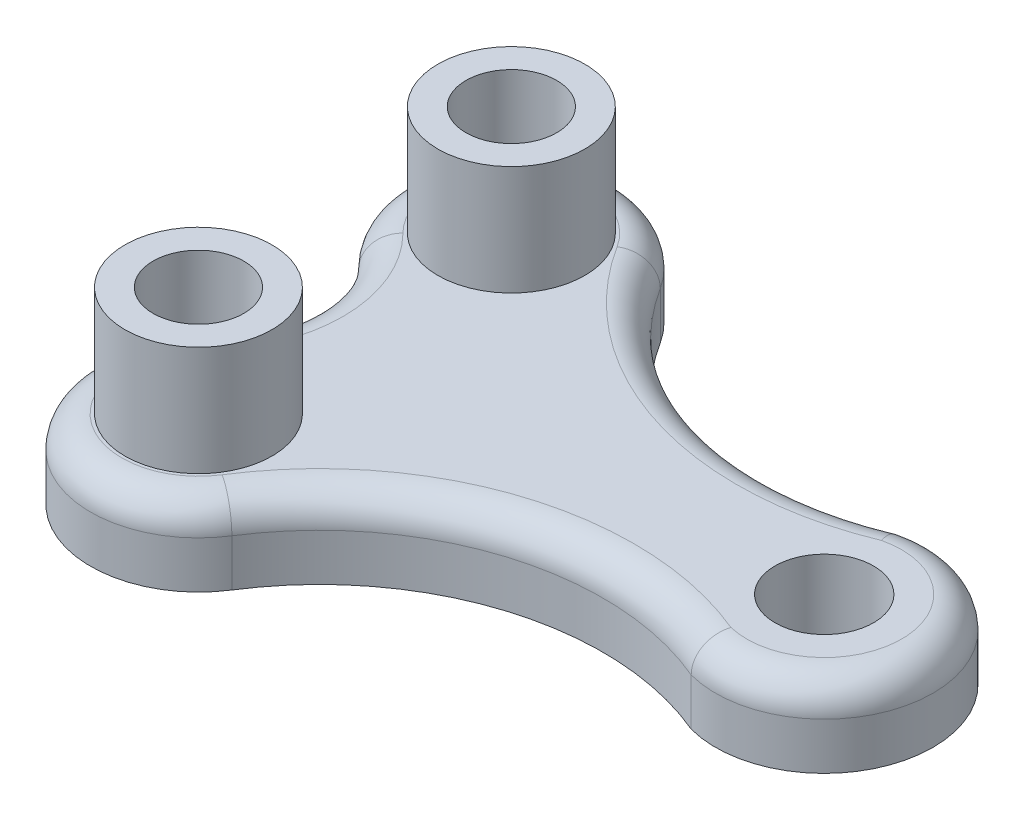
ISO-10303-21;
HEADER;
FILE_DESCRIPTION(('STEP AP214'),'2;1');
FILE_NAME('part.step','',(''),(''),'','','');
FILE_SCHEMA(('AUTOMOTIVE_DESIGN { 1 0 10303 214 1 1 1 1 }'));
ENDSEC;
DATA;
#1=APPLICATION_CONTEXT('core data for automotive mechanical design processes');
#2=APPLICATION_PROTOCOL_DEFINITION('international standard','automotive_design',2000,#1);
#3=PRODUCT_CONTEXT('',#1,'mechanical');
#4=PRODUCT('Part','Part','',(#3));
#5=PRODUCT_RELATED_PRODUCT_CATEGORY('part','',(#4));
#6=PRODUCT_DEFINITION_FORMATION('','',#4);
#7=PRODUCT_DEFINITION_CONTEXT('part definition',#1,'design');
#8=PRODUCT_DEFINITION('design','',#6,#7);
#9=PRODUCT_DEFINITION_SHAPE('','',#8);
#10=(LENGTH_UNIT() NAMED_UNIT(*) SI_UNIT(.MILLI.,.METRE.));
#11=(NAMED_UNIT(*) PLANE_ANGLE_UNIT() SI_UNIT($,.RADIAN.));
#12=(NAMED_UNIT(*) SI_UNIT($,.STERADIAN.) SOLID_ANGLE_UNIT());
#13=UNCERTAINTY_MEASURE_WITH_UNIT(LENGTH_MEASURE(1.E-05),#10,'distance_accuracy_value','');
#14=(GEOMETRIC_REPRESENTATION_CONTEXT(3) GLOBAL_UNCERTAINTY_ASSIGNED_CONTEXT((#13)) GLOBAL_UNIT_ASSIGNED_CONTEXT((#10,
#11,#12)) REPRESENTATION_CONTEXT('',''));
#15=CARTESIAN_POINT('',(0.,0.,0.));
#16=DIRECTION('',(0.,0.,1.));
#17=DIRECTION('',(1.,0.,0.));
#18=AXIS2_PLACEMENT_3D('',#15,#16,#17);
#19=CARTESIAN_POINT('',(0.,6.,-5.));
#20=DIRECTION('',(0.,1.,0.));
#21=DIRECTION('',(0.,0.,1.));
#22=AXIS2_PLACEMENT_3D('',#19,#20,#21);
#23=PLANE('',#22);
#24=CARTESIAN_POINT('',(0.,6.,-5.));
#25=DIRECTION('',(0.,1.,0.));
#26=DIRECTION('',(0.,0.,1.));
#27=AXIS2_PLACEMENT_3D('',#24,#25,#26);
#28=CIRCLE('',#27,1.45);
#29=CARTESIAN_POINT('',(0.,6.,-3.55));
#30=VERTEX_POINT('',#29);
#31=EDGE_CURVE('E168',#30,#30,#28,.T.);
#32=ORIENTED_EDGE('',*,*,#31,.F.);
#33=EDGE_LOOP('',(#32));
#34=FACE_BOUND('',#33,.T.);
#35=CARTESIAN_POINT('',(0.,6.,-5.));
#36=DIRECTION('',(0.,1.,0.));
#37=DIRECTION('',(0.,0.,1.));
#38=AXIS2_PLACEMENT_3D('',#35,#36,#37);
#39=CIRCLE('',#38,2.35);
#40=CARTESIAN_POINT('',(0.,6.,-2.65));
#41=VERTEX_POINT('',#40);
#42=EDGE_CURVE('E235',#41,#41,#39,.T.);
#43=ORIENTED_EDGE('',*,*,#42,.T.);
#44=EDGE_LOOP('',(#43));
#45=FACE_BOUND('',#44,.T.);
#46=ADVANCED_FACE('F39',(#34,#45),#23,.T.);
#47=CARTESIAN_POINT('',(0.,6.,5.));
#48=DIRECTION('',(0.,1.,0.));
#49=DIRECTION('',(0.,0.,1.));
#50=AXIS2_PLACEMENT_3D('',#47,#48,#49);
#51=PLANE('',#50);
#52=CARTESIAN_POINT('',(0.,6.,5.));
#53=DIRECTION('',(0.,1.,0.));
#54=DIRECTION('',(0.,0.,1.));
#55=AXIS2_PLACEMENT_3D('',#52,#53,#54);
#56=CIRCLE('',#55,1.45);
#57=CARTESIAN_POINT('',(0.,6.,6.45));
#58=VERTEX_POINT('',#57);
#59=EDGE_CURVE('E220',#58,#58,#56,.T.);
#60=ORIENTED_EDGE('',*,*,#59,.F.);
#61=EDGE_LOOP('',(#60));
#62=FACE_BOUND('',#61,.T.);
#63=CARTESIAN_POINT('',(0.,6.,5.));
#64=DIRECTION('',(0.,1.,0.));
#65=DIRECTION('',(0.,0.,1.));
#66=AXIS2_PLACEMENT_3D('',#63,#64,#65);
#67=CIRCLE('',#66,2.35000000000001);
#68=CARTESIAN_POINT('',(0.,6.,7.35000000000001));
#69=VERTEX_POINT('',#68);
#70=EDGE_CURVE('E238',#69,#69,#67,.T.);
#71=ORIENTED_EDGE('',*,*,#70,.T.);
#72=EDGE_LOOP('',(#71));
#73=FACE_BOUND('',#72,.T.);
#74=ADVANCED_FACE('F261',(#62,#73),#51,.T.);
#75=CARTESIAN_POINT('',(0.,2.5,-5.));
#76=DIRECTION('',(0.,-1.,0.));
#77=DIRECTION('',(0.,0.,-1.));
#78=AXIS2_PLACEMENT_3D('',#75,#76,#77);
#79=CYLINDRICAL_SURFACE('',#78,1.45);
#80=CARTESIAN_POINT('',(0.,0.,-5.));
#81=DIRECTION('',(0.,1.,0.));
#82=DIRECTION('',(0.,0.,1.));
#83=AXIS2_PLACEMENT_3D('',#80,#81,#82);
#84=CIRCLE('',#83,1.45);
#85=CARTESIAN_POINT('',(0.,0.,-3.55));
#86=VERTEX_POINT('',#85);
#87=EDGE_CURVE('E213',#86,#86,#84,.T.);
#88=ORIENTED_EDGE('',*,*,#87,.F.);
#89=EDGE_LOOP('',(#88));
#90=FACE_BOUND('',#89,.T.);
#91=ORIENTED_EDGE('',*,*,#31,.T.);
#92=EDGE_LOOP('',(#91));
#93=FACE_BOUND('',#92,.T.);
#94=ADVANCED_FACE('F268',(#90,#93),#79,.F.);
#95=CARTESIAN_POINT('',(0.,2.5,5.));
#96=DIRECTION('',(0.,-1.,0.));
#97=DIRECTION('',(0.,0.,-1.));
#98=AXIS2_PLACEMENT_3D('',#95,#96,#97);
#99=CYLINDRICAL_SURFACE('',#98,1.45);
#100=CARTESIAN_POINT('',(0.,0.,5.));
#101=DIRECTION('',(0.,1.,0.));
#102=DIRECTION('',(0.,0.,-1.));
#103=AXIS2_PLACEMENT_3D('',#100,#101,#102);
#104=CIRCLE('',#103,1.45);
#105=CARTESIAN_POINT('',(0.,0.,3.55));
#106=VERTEX_POINT('',#105);
#107=EDGE_CURVE('E216',#106,#106,#104,.T.);
#108=ORIENTED_EDGE('',*,*,#107,.F.);
#109=EDGE_LOOP('',(#108));
#110=FACE_BOUND('',#109,.T.);
#111=ORIENTED_EDGE('',*,*,#59,.T.);
#112=EDGE_LOOP('',(#111));
#113=FACE_BOUND('',#112,.T.);
#114=ADVANCED_FACE('F249',(#110,#113),#99,.F.);
#115=CARTESIAN_POINT('',(-2.5,2.5,-2.5));
#116=DIRECTION('',(0.,1.,0.));
#117=DIRECTION('',(0.,0.,1.));
#118=AXIS2_PLACEMENT_3D('',#115,#116,#117);
#119=PLANE('',#118);
#120=CARTESIAN_POINT('',(15.,2.5,0.));
#121=DIRECTION('',(0.,1.,0.));
#122=DIRECTION('',(0.,0.,1.));
#123=AXIS2_PLACEMENT_3D('',#120,#121,#122);
#124=CIRCLE('',#123,1.575);
#125=CARTESIAN_POINT('',(15.,2.5,1.575));
#126=VERTEX_POINT('',#125);
#127=EDGE_CURVE('E226',#126,#126,#124,.T.);
#128=ORIENTED_EDGE('',*,*,#127,.F.);
#129=EDGE_LOOP('',(#128));
#130=FACE_BOUND('',#129,.T.);
#131=CARTESIAN_POINT('',(15.,2.5,0.));
#132=DIRECTION('',(0.,1.,0.));
#133=DIRECTION('',(0.,0.,1.));
#134=AXIS2_PLACEMENT_3D('',#131,#132,#133);
#135=CIRCLE('',#134,2.475);
#136=CARTESIAN_POINT('',(14.4239808348916,2.5,2.40703695888282));
#137=VERTEX_POINT('',#136);
#138=CARTESIAN_POINT('',(14.4239808348916,2.5,-2.40703695888282));
#139=VERTEX_POINT('',#138);
#140=EDGE_CURVE('E131',#137,#139,#135,.T.);
#141=ORIENTED_EDGE('',*,*,#140,.T.);
#142=CARTESIAN_POINT('',(10.5657096744367,2.5,-11.69712902331));
#143=DIRECTION('',(0.,1.,0.));
#144=DIRECTION('',(0.,0.,1.));
#145=AXIS2_PLACEMENT_3D('',#142,#143,#144);
#146=CIRCLE('',#145,10.0594267686152);
#147=CARTESIAN_POINT('',(2.06931853722626,2.5,-6.311648120302));
#148=VERTEX_POINT('',#147);
#149=EDGE_CURVE('E130',#139,#148,#146,.F.);
#150=ORIENTED_EDGE('',*,*,#149,.T.);
#151=CARTESIAN_POINT('',(0.,2.5,-5.));
#152=DIRECTION('',(0.,1.,0.));
#153=DIRECTION('',(0.,0.,1.));
#154=AXIS2_PLACEMENT_3D('',#151,#152,#153);
#155=CIRCLE('',#154,2.45);
#156=CARTESIAN_POINT('',(-1.73241161390704,2.5,-3.26758838609296));
#157=VERTEX_POINT('',#156);
#158=EDGE_CURVE('E122',#148,#157,#155,.T.);
#159=ORIENTED_EDGE('',*,*,#158,.T.);
#160=CARTESIAN_POINT('',(-5.,2.5,0.));
#161=DIRECTION('',(0.,1.,0.));
#162=DIRECTION('',(0.,0.,1.));
#163=AXIS2_PLACEMENT_3D('',#160,#161,#162);
#164=CIRCLE('',#163,4.62106781186548);
#165=CARTESIAN_POINT('',(-1.73241161390704,2.5,3.26758838609296));
#166=VERTEX_POINT('',#165);
#167=EDGE_CURVE('E117',#157,#166,#164,.F.);
#168=ORIENTED_EDGE('',*,*,#167,.T.);
#169=CARTESIAN_POINT('',(0.,2.5,5.));
#170=DIRECTION('',(0.,1.,0.));
#171=DIRECTION('',(0.,0.,1.));
#172=AXIS2_PLACEMENT_3D('',#169,#170,#171);
#173=CIRCLE('',#172,2.45);
#174=CARTESIAN_POINT('',(2.06931853722627,2.5,6.31164812030201));
#175=VERTEX_POINT('',#174);
#176=EDGE_CURVE('E110',#166,#175,#173,.T.);
#177=ORIENTED_EDGE('',*,*,#176,.T.);
#178=CARTESIAN_POINT('',(10.5657096744367,2.5,11.69712902331));
#179=DIRECTION('',(0.,1.,0.));
#180=DIRECTION('',(0.,0.,1.));
#181=AXIS2_PLACEMENT_3D('',#178,#179,#180);
#182=CIRCLE('',#181,10.0594267686152);
#183=EDGE_CURVE('E114',#175,#137,#182,.F.);
#184=ORIENTED_EDGE('',*,*,#183,.T.);
#185=EDGE_LOOP('',(#141,#150,#159,#168,#177,#184));
#186=FACE_BOUND('',#185,.T.);
#187=CARTESIAN_POINT('',(0.,2.5,5.));
#188=DIRECTION('',(0.,1.,0.));
#189=DIRECTION('',(0.,0.,1.));
#190=AXIS2_PLACEMENT_3D('',#187,#188,#189);
#191=CIRCLE('',#190,2.35000000000001);
#192=CARTESIAN_POINT('',(0.,2.5,7.35000000000001));
#193=VERTEX_POINT('',#192);
#194=EDGE_CURVE('E229',#193,#193,#191,.T.);
#195=ORIENTED_EDGE('',*,*,#194,.F.);
#196=EDGE_LOOP('',(#195));
#197=FACE_BOUND('',#196,.T.);
#198=CARTESIAN_POINT('',(0.,2.5,-5.));
#199=DIRECTION('',(0.,1.,0.));
#200=DIRECTION('',(0.,0.,1.));
#201=AXIS2_PLACEMENT_3D('',#198,#199,#200);
#202=CIRCLE('',#201,2.35);
#203=CARTESIAN_POINT('',(0.,2.5,-2.65));
#204=VERTEX_POINT('',#203);
#205=EDGE_CURVE('E232',#204,#204,#202,.T.);
#206=ORIENTED_EDGE('',*,*,#205,.F.);
#207=EDGE_LOOP('',(#206));
#208=FACE_BOUND('',#207,.T.);
#209=ADVANCED_FACE('F112',(#130,#186,#197,#208),#119,.T.);
#210=CARTESIAN_POINT('',(-2.5,0.,-2.5));
#211=DIRECTION('',(0.,1.,0.));
#212=DIRECTION('',(0.,0.,1.));
#213=AXIS2_PLACEMENT_3D('',#210,#211,#212);
#214=PLANE('',#213);
#215=CARTESIAN_POINT('',(15.,0.,0.));
#216=DIRECTION('',(0.,1.,0.));
#217=DIRECTION('',(0.,0.,1.));
#218=AXIS2_PLACEMENT_3D('',#215,#216,#217);
#219=CIRCLE('',#218,1.575);
#220=CARTESIAN_POINT('',(15.,0.,1.575));
#221=VERTEX_POINT('',#220);
#222=EDGE_CURVE('E223',#221,#221,#219,.T.);
#223=ORIENTED_EDGE('',*,*,#222,.T.);
#224=EDGE_LOOP('',(#223));
#225=FACE_BOUND('',#224,.T.);
#226=CARTESIAN_POINT('',(-5.,0.,0.));
#227=DIRECTION('',(0.,-1.,0.));
#228=DIRECTION('',(0.,0.,1.));
#229=AXIS2_PLACEMENT_3D('',#226,#227,#228);
#230=CIRCLE('',#229,3.62106781186548);
#231=CARTESIAN_POINT('',(-2.43951839509359,0.,-2.56048160490641));
#232=VERTEX_POINT('',#231);
#233=CARTESIAN_POINT('',(-2.43951839509359,0.,2.56048160490641));
#234=VERTEX_POINT('',#233);
#235=EDGE_CURVE('E210',#232,#234,#230,.T.);
#236=ORIENTED_EDGE('',*,*,#235,.F.);
#237=CARTESIAN_POINT('',(0.,0.,-5.));
#238=DIRECTION('',(0.,1.,0.));
#239=DIRECTION('',(0.,0.,1.));
#240=AXIS2_PLACEMENT_3D('',#237,#238,#239);
#241=CIRCLE('',#240,3.45);
#242=CARTESIAN_POINT('',(2.91393834833902,0.,-6.8470147000171));
#243=VERTEX_POINT('',#242);
#244=EDGE_CURVE('E195',#243,#232,#241,.T.);
#245=ORIENTED_EDGE('',*,*,#244,.F.);
#246=CARTESIAN_POINT('',(10.5657096744367,0.,-11.69712902331));
#247=DIRECTION('',(0.,-1.,0.));
#248=DIRECTION('',(0.,0.,1.));
#249=AXIS2_PLACEMENT_3D('',#246,#247,#248);
#250=CIRCLE('',#249,9.05942676861521);
#251=CARTESIAN_POINT('',(14.105637622671,0.,-3.3579370062612));
#252=VERTEX_POINT('',#251);
#253=EDGE_CURVE('E198',#252,#243,#250,.T.);
#254=ORIENTED_EDGE('',*,*,#253,.F.);
#255=CARTESIAN_POINT('',(15.,0.,0.));
#256=DIRECTION('',(0.,1.,0.));
#257=DIRECTION('',(0.,0.,1.));
#258=AXIS2_PLACEMENT_3D('',#255,#256,#257);
#259=CIRCLE('',#258,3.475);
#260=CARTESIAN_POINT('',(14.105637622671,0.,3.3579370062612));
#261=VERTEX_POINT('',#260);
#262=EDGE_CURVE('E201',#261,#252,#259,.T.);
#263=ORIENTED_EDGE('',*,*,#262,.F.);
#264=CARTESIAN_POINT('',(10.5657096744367,0.,11.69712902331));
#265=DIRECTION('',(0.,-1.,0.));
#266=DIRECTION('',(0.,0.,-1.));
#267=AXIS2_PLACEMENT_3D('',#264,#265,#266);
#268=CIRCLE('',#267,9.05942676861521);
#269=CARTESIAN_POINT('',(2.91393834833902,0.,6.8470147000171));
#270=VERTEX_POINT('',#269);
#271=EDGE_CURVE('E204',#270,#261,#268,.T.);
#272=ORIENTED_EDGE('',*,*,#271,.F.);
#273=CARTESIAN_POINT('',(0.,0.,5.));
#274=DIRECTION('',(0.,1.,0.));
#275=DIRECTION('',(0.,0.,-1.));
#276=AXIS2_PLACEMENT_3D('',#273,#274,#275);
#277=CIRCLE('',#276,3.45);
#278=EDGE_CURVE('E207',#234,#270,#277,.T.);
#279=ORIENTED_EDGE('',*,*,#278,.F.);
#280=EDGE_LOOP('',(#236,#245,#254,#263,#272,#279));
#281=FACE_BOUND('',#280,.T.);
#282=ORIENTED_EDGE('',*,*,#87,.T.);
#283=EDGE_LOOP('',(#282));
#284=FACE_BOUND('',#283,.T.);
#285=ORIENTED_EDGE('',*,*,#107,.T.);
#286=EDGE_LOOP('',(#285));
#287=FACE_BOUND('',#286,.T.);
#288=ADVANCED_FACE('F248',(#225,#281,#284,#287),#214,.F.);
#289=CARTESIAN_POINT('',(-5.,2.5,0.));
#290=DIRECTION('',(0.,-1.,0.));
#291=DIRECTION('',(0.,0.,-1.));
#292=AXIS2_PLACEMENT_3D('',#289,#290,#291);
#293=CYLINDRICAL_SURFACE('',#292,3.62106781186548);
#294=DIRECTION('',(0.,-1.,0.));
#295=VECTOR('',#294,1.);
#296=CARTESIAN_POINT('',(-2.43951839509359,2.5,2.56048160490641));
#297=LINE('',#296,#295);
#298=CARTESIAN_POINT('',(-2.43951839509359,1.5,2.56048160490641));
#299=VERTEX_POINT('',#298);
#300=EDGE_CURVE('E183',#299,#234,#297,.T.);
#301=ORIENTED_EDGE('',*,*,#300,.F.);
#302=CARTESIAN_POINT('',(-5.,1.5,0.));
#303=DIRECTION('',(0.,1.,0.));
#304=DIRECTION('',(0.,0.,1.));
#305=AXIS2_PLACEMENT_3D('',#302,#303,#304);
#306=CIRCLE('',#305,3.62106781186548);
#307=CARTESIAN_POINT('',(-2.43951839509359,1.5,-2.56048160490641));
#308=VERTEX_POINT('',#307);
#309=EDGE_CURVE('E11',#299,#308,#306,.T.);
#310=ORIENTED_EDGE('',*,*,#309,.T.);
#311=DIRECTION('',(0.,-1.,0.));
#312=VECTOR('',#311,1.);
#313=CARTESIAN_POINT('',(-2.43951839509359,2.5,-2.56048160490641));
#314=LINE('',#313,#312);
#315=EDGE_CURVE('E193',#308,#232,#314,.T.);
#316=ORIENTED_EDGE('',*,*,#315,.T.);
#317=ORIENTED_EDGE('',*,*,#235,.T.);
#318=EDGE_LOOP('',(#301,#310,#316,#317));
#319=FACE_BOUND('',#318,.T.);
#320=ADVANCED_FACE('F156',(#319),#293,.F.);
#321=CARTESIAN_POINT('',(0.,2.5,5.));
#322=DIRECTION('',(0.,-1.,0.));
#323=DIRECTION('',(0.,0.,-1.));
#324=AXIS2_PLACEMENT_3D('',#321,#322,#323);
#325=CYLINDRICAL_SURFACE('',#324,3.45);
#326=DIRECTION('',(0.,-1.,0.));
#327=VECTOR('',#326,1.);
#328=CARTESIAN_POINT('',(2.91393834833902,2.5,6.8470147000171));
#329=LINE('',#328,#327);
#330=CARTESIAN_POINT('',(2.91393834833902,1.5,6.8470147000171));
#331=VERTEX_POINT('',#330);
#332=EDGE_CURVE('E185',#331,#270,#329,.T.);
#333=ORIENTED_EDGE('',*,*,#332,.F.);
#334=CARTESIAN_POINT('',(0.,1.5,5.));
#335=DIRECTION('',(0.,1.,0.));
#336=DIRECTION('',(0.,0.,1.));
#337=AXIS2_PLACEMENT_3D('',#334,#335,#336);
#338=CIRCLE('',#337,3.45);
#339=EDGE_CURVE('E48',#331,#299,#338,.F.);
#340=ORIENTED_EDGE('',*,*,#339,.T.);
#341=ORIENTED_EDGE('',*,*,#300,.T.);
#342=ORIENTED_EDGE('',*,*,#278,.T.);
#343=EDGE_LOOP('',(#333,#340,#341,#342));
#344=FACE_BOUND('',#343,.T.);
#345=ADVANCED_FACE('F298',(#344),#325,.T.);
#346=CARTESIAN_POINT('',(10.5657096744367,2.5,11.69712902331));
#347=DIRECTION('',(0.,-1.,0.));
#348=DIRECTION('',(0.,0.,-1.));
#349=AXIS2_PLACEMENT_3D('',#346,#347,#348);
#350=CYLINDRICAL_SURFACE('',#349,9.05942676861521);
#351=DIRECTION('',(0.,-1.,0.));
#352=VECTOR('',#351,1.);
#353=CARTESIAN_POINT('',(14.105637622671,2.5,3.3579370062612));
#354=LINE('',#353,#352);
#355=CARTESIAN_POINT('',(14.105637622671,1.5,3.3579370062612));
#356=VERTEX_POINT('',#355);
#357=EDGE_CURVE('E187',#356,#261,#354,.T.);
#358=ORIENTED_EDGE('',*,*,#357,.F.);
#359=CARTESIAN_POINT('',(10.5657096744367,1.5,11.69712902331));
#360=DIRECTION('',(0.,1.,0.));
#361=DIRECTION('',(0.,0.,1.));
#362=AXIS2_PLACEMENT_3D('',#359,#360,#361);
#363=CIRCLE('',#362,9.05942676861521);
#364=EDGE_CURVE('E63',#356,#331,#363,.T.);
#365=ORIENTED_EDGE('',*,*,#364,.T.);
#366=ORIENTED_EDGE('',*,*,#332,.T.);
#367=ORIENTED_EDGE('',*,*,#271,.T.);
#368=EDGE_LOOP('',(#358,#365,#366,#367));
#369=FACE_BOUND('',#368,.T.);
#370=ADVANCED_FACE('F295',(#369),#350,.F.);
#371=CARTESIAN_POINT('',(15.,2.5,0.));
#372=DIRECTION('',(0.,-1.,0.));
#373=DIRECTION('',(0.,0.,-1.));
#374=AXIS2_PLACEMENT_3D('',#371,#372,#373);
#375=CYLINDRICAL_SURFACE('',#374,3.475);
#376=DIRECTION('',(0.,-1.,0.));
#377=VECTOR('',#376,1.);
#378=CARTESIAN_POINT('',(14.105637622671,2.5,-3.3579370062612));
#379=LINE('',#378,#377);
#380=CARTESIAN_POINT('',(14.105637622671,1.5,-3.3579370062612));
#381=VERTEX_POINT('',#380);
#382=EDGE_CURVE('E189',#381,#252,#379,.T.);
#383=ORIENTED_EDGE('',*,*,#382,.F.);
#384=CARTESIAN_POINT('',(15.,1.5,0.));
#385=DIRECTION('',(0.,1.,0.));
#386=DIRECTION('',(0.,0.,1.));
#387=AXIS2_PLACEMENT_3D('',#384,#385,#386);
#388=CIRCLE('',#387,3.475);
#389=EDGE_CURVE('E171',#381,#356,#388,.F.);
#390=ORIENTED_EDGE('',*,*,#389,.T.);
#391=ORIENTED_EDGE('',*,*,#357,.T.);
#392=ORIENTED_EDGE('',*,*,#262,.T.);
#393=EDGE_LOOP('',(#383,#390,#391,#392));
#394=FACE_BOUND('',#393,.T.);
#395=ADVANCED_FACE('F291',(#394),#375,.T.);
#396=CARTESIAN_POINT('',(10.5657096744367,2.5,-11.69712902331));
#397=DIRECTION('',(0.,-1.,0.));
#398=DIRECTION('',(0.,0.,-1.));
#399=AXIS2_PLACEMENT_3D('',#396,#397,#398);
#400=CYLINDRICAL_SURFACE('',#399,9.05942676861521);
#401=DIRECTION('',(0.,-1.,0.));
#402=VECTOR('',#401,1.);
#403=CARTESIAN_POINT('',(2.91393834833902,2.5,-6.8470147000171));
#404=LINE('',#403,#402);
#405=CARTESIAN_POINT('',(2.91393834833902,1.5,-6.8470147000171));
#406=VERTEX_POINT('',#405);
#407=EDGE_CURVE('E191',#406,#243,#404,.T.);
#408=ORIENTED_EDGE('',*,*,#407,.F.);
#409=CARTESIAN_POINT('',(10.5657096744367,1.5,-11.69712902331));
#410=DIRECTION('',(0.,1.,0.));
#411=DIRECTION('',(0.,0.,1.));
#412=AXIS2_PLACEMENT_3D('',#409,#410,#411);
#413=CIRCLE('',#412,9.05942676861521);
#414=EDGE_CURVE('E176',#406,#381,#413,.T.);
#415=ORIENTED_EDGE('',*,*,#414,.T.);
#416=ORIENTED_EDGE('',*,*,#382,.T.);
#417=ORIENTED_EDGE('',*,*,#253,.T.);
#418=EDGE_LOOP('',(#408,#415,#416,#417));
#419=FACE_BOUND('',#418,.T.);
#420=ADVANCED_FACE('F287',(#419),#400,.F.);
#421=CARTESIAN_POINT('',(0.,2.5,-5.));
#422=DIRECTION('',(0.,-1.,0.));
#423=DIRECTION('',(0.,0.,-1.));
#424=AXIS2_PLACEMENT_3D('',#421,#422,#423);
#425=CYLINDRICAL_SURFACE('',#424,3.45);
#426=ORIENTED_EDGE('',*,*,#315,.F.);
#427=CARTESIAN_POINT('',(0.,1.5,-5.));
#428=DIRECTION('',(0.,1.,0.));
#429=DIRECTION('',(0.,0.,1.));
#430=AXIS2_PLACEMENT_3D('',#427,#428,#429);
#431=CIRCLE('',#430,3.45);
#432=EDGE_CURVE('E174',#308,#406,#431,.F.);
#433=ORIENTED_EDGE('',*,*,#432,.T.);
#434=ORIENTED_EDGE('',*,*,#407,.T.);
#435=ORIENTED_EDGE('',*,*,#244,.T.);
#436=EDGE_LOOP('',(#426,#433,#434,#435));
#437=FACE_BOUND('',#436,.T.);
#438=ADVANCED_FACE('F284',(#437),#425,.T.);
#439=CARTESIAN_POINT('',(0.,1.5,5.));
#440=DIRECTION('',(0.,1.,0.));
#441=DIRECTION('',(0.,0.,1.));
#442=AXIS2_PLACEMENT_3D('',#439,#440,#441);
#443=TOROIDAL_SURFACE('',#442,2.45,1.);
#444=CARTESIAN_POINT('',(-1.73241161390704,1.5,3.26758838609296));
#445=DIRECTION('',(0.707106781186547,0.,-0.707106781186548));
#446=DIRECTION('',(-0.707106781186548,0.,-0.707106781186547));
#447=AXIS2_PLACEMENT_3D('',#444,#445,#446);
#448=CIRCLE('',#447,1.);
#449=EDGE_CURVE('E133',#299,#166,#448,.T.);
#450=ORIENTED_EDGE('',*,*,#449,.F.);
#451=ORIENTED_EDGE('',*,*,#339,.F.);
#452=CARTESIAN_POINT('',(2.06931853722626,1.5,6.311648120302));
#453=DIRECTION('',(0.5353665797151,0.,-0.84461981111276));
#454=DIRECTION('',(-0.844619811112761,0.,-0.5353665797151));
#455=AXIS2_PLACEMENT_3D('',#452,#453,#454);
#456=CIRCLE('',#455,1.);
#457=EDGE_CURVE('E43',#175,#331,#456,.T.);
#458=ORIENTED_EDGE('',*,*,#457,.F.);
#459=ORIENTED_EDGE('',*,*,#176,.F.);
#460=EDGE_LOOP('',(#450,#451,#458,#459));
#461=FACE_BOUND('',#460,.T.);
#462=ADVANCED_FACE('F41',(#461),#443,.T.);
#463=CARTESIAN_POINT('',(10.5657096744367,1.5,11.69712902331));
#464=DIRECTION('',(0.,1.,0.));
#465=DIRECTION('',(0.,0.,1.));
#466=AXIS2_PLACEMENT_3D('',#463,#464,#465);
#467=TOROIDAL_SURFACE('',#466,10.0594267686152,1.);
#468=ORIENTED_EDGE('',*,*,#457,.T.);
#469=ORIENTED_EDGE('',*,*,#364,.F.);
#470=CARTESIAN_POINT('',(14.105637622671,1.5,3.3579370062612));
#471=CARTESIAN_POINT('',(14.1056375818849,1.52808148194348,3.35793682949158));
#472=CARTESIAN_POINT('',(14.1060231041089,1.55614949373156,3.35681481531601));
#473=CARTESIAN_POINT('',(14.1075604447362,1.61208432269306,3.35233865720389));
#474=CARTESIAN_POINT('',(14.1087122229838,1.63995115033223,3.34898463023652));
#475=CARTESIAN_POINT('',(14.1133047080113,1.72290170127911,3.33560638177966));
#476=CARTESIAN_POINT('',(14.1178826007752,1.77742917312218,3.32226590439208));
#477=CARTESIAN_POINT('',(14.129926646421,1.88333951247459,3.2871117302345));
#478=CARTESIAN_POINT('',(14.1373941116221,1.93472093888792,3.26529418352729));
#479=CARTESIAN_POINT('',(14.1549770969907,2.03288456176555,3.2138067910618));
#480=CARTESIAN_POINT('',(14.1650920392013,2.07966775898304,3.18413865910851));
#481=CARTESIAN_POINT('',(14.1876605345121,2.16736355156412,3.11775343463421));
#482=CARTESIAN_POINT('',(14.200116373048,2.20827034029226,3.08102945264138));
#483=CARTESIAN_POINT('',(14.2269736131082,2.28302582593105,3.00157039849111));
#484=CARTESIAN_POINT('',(14.2413756721517,2.31687212762499,2.95883329463404));
#485=CARTESIAN_POINT('',(14.2717119879946,2.37662118716666,2.86844734477557));
#486=CARTESIAN_POINT('',(14.2876501506608,2.40250295427467,2.82078595436375));
#487=CARTESIAN_POINT('',(14.3205324120906,2.44546620636042,2.7219988012931));
#488=CARTESIAN_POINT('',(14.3374756418847,2.46255517329426,2.67087602605269));
#489=CARTESIAN_POINT('',(14.3652896771575,2.48273566770808,2.58652115909544));
#490=CARTESIAN_POINT('',(14.3760150539098,2.48867950039999,2.55389229065777));
#491=CARTESIAN_POINT('',(14.3975248981077,2.49697107097982,2.48823561910131));
#492=CARTESIAN_POINT('',(14.4083092492549,2.49932432740939,2.45520850697808));
#493=CARTESIAN_POINT('',(14.4207019900711,2.49995818352795,2.41712197090213));
#494=CARTESIAN_POINT('',(14.4223419126844,2.50000011096781,2.41207929699268));
#495=CARTESIAN_POINT('',(14.4239808348916,2.5,2.40703695888282));
#496=B_SPLINE_CURVE_WITH_KNOTS('',3,(#470,#471,#472,#473,#474,#475,#476,#477,#478,#479,#480,
#481,#482,#483,#484,#485,#486,#487,#488,#489,#490,#491,#492,#493,#494,#495),.UNSPECIFIED.,.F.,
.F.,(4,2,2,2,2,2,2,2,2,2,2,2,4),(0.,0.0841926448546979,0.168380877920731,0.336479883405255,
0.504655321968572,0.672794077602204,0.841097849340906,1.00945862433838,1.17825939165894,
1.34691628475378,1.45132658890111,1.5555762572481,1.57148387422591),.UNSPECIFIED.);
#497=EDGE_CURVE('E128',#137,#356,#496,.F.);
#498=ORIENTED_EDGE('',*,*,#497,.F.);
#499=ORIENTED_EDGE('',*,*,#183,.F.);
#500=EDGE_LOOP('',(#468,#469,#498,#499));
#501=FACE_BOUND('',#500,.T.);
#502=ADVANCED_FACE('F126',(#501),#467,.T.);
#503=CARTESIAN_POINT('',(-5.,1.5,0.));
#504=DIRECTION('',(0.,1.,0.));
#505=DIRECTION('',(0.,0.,1.));
#506=AXIS2_PLACEMENT_3D('',#503,#504,#505);
#507=TOROIDAL_SURFACE('',#506,4.62106781186548,1.);
#508=ORIENTED_EDGE('',*,*,#449,.T.);
#509=ORIENTED_EDGE('',*,*,#167,.F.);
#510=CARTESIAN_POINT('',(-1.73241161390704,1.5,-3.26758838609296));
#511=DIRECTION('',(-0.707106781186548,0.,-0.707106781186547));
#512=DIRECTION('',(-0.707106781186547,0.,0.707106781186548));
#513=AXIS2_PLACEMENT_3D('',#510,#511,#512);
#514=CIRCLE('',#513,1.);
#515=EDGE_CURVE('E136',#308,#157,#514,.T.);
#516=ORIENTED_EDGE('',*,*,#515,.F.);
#517=ORIENTED_EDGE('',*,*,#309,.F.);
#518=EDGE_LOOP('',(#508,#509,#516,#517));
#519=FACE_BOUND('',#518,.T.);
#520=ADVANCED_FACE('F154',(#519),#507,.T.);
#521=CARTESIAN_POINT('',(15.,1.5,0.));
#522=DIRECTION('',(0.,1.,0.));
#523=DIRECTION('',(0.,0.,1.));
#524=AXIS2_PLACEMENT_3D('',#521,#522,#523);
#525=TOROIDAL_SURFACE('',#524,2.475,1.);
#526=ORIENTED_EDGE('',*,*,#497,.T.);
#527=ORIENTED_EDGE('',*,*,#389,.F.);
#528=CARTESIAN_POINT('',(14.105637622671,1.5,-3.3579370062612));
#529=CARTESIAN_POINT('',(14.105637581885,1.52808148194348,-3.35793682949158));
#530=CARTESIAN_POINT('',(14.1060231041089,1.55614949373156,-3.35681481531601));
#531=CARTESIAN_POINT('',(14.1075604447362,1.61208432269306,-3.35233865720389));
#532=CARTESIAN_POINT('',(14.1087122229838,1.63995115033223,-3.34898463023652));
#533=CARTESIAN_POINT('',(14.1133047080113,1.72290170127911,-3.33560638177965));
#534=CARTESIAN_POINT('',(14.1178826007752,1.77742917312218,-3.32226590439208));
#535=CARTESIAN_POINT('',(14.129926646421,1.88333951247459,-3.28711173023451));
#536=CARTESIAN_POINT('',(14.1373941116221,1.93472093888792,-3.2652941835273));
#537=CARTESIAN_POINT('',(14.1549770969907,2.03288456176555,-3.2138067910618));
#538=CARTESIAN_POINT('',(14.1650920392013,2.07966775898304,-3.18413865910851));
#539=CARTESIAN_POINT('',(14.1876605345121,2.16736355156412,-3.11775343463421));
#540=CARTESIAN_POINT('',(14.200116373048,2.20827034029226,-3.08102945264138));
#541=CARTESIAN_POINT('',(14.2269736131082,2.28302582593105,-3.00157039849111));
#542=CARTESIAN_POINT('',(14.2413756721516,2.31687212762499,-2.95883329463403));
#543=CARTESIAN_POINT('',(14.2717119879946,2.37662118716666,-2.86844734477556));
#544=CARTESIAN_POINT('',(14.2876501506608,2.40250295427468,-2.82078595436375));
#545=CARTESIAN_POINT('',(14.3205324120906,2.44546620636042,-2.72199880129309));
#546=CARTESIAN_POINT('',(14.3374756418846,2.46255517329426,-2.67087602605268));
#547=CARTESIAN_POINT('',(14.3652896771575,2.48273566770808,-2.58652115909544));
#548=CARTESIAN_POINT('',(14.3760150539099,2.48867950039999,-2.55389229065778));
#549=CARTESIAN_POINT('',(14.3975248981077,2.49697107097982,-2.4882356191013));
#550=CARTESIAN_POINT('',(14.4083092492548,2.49932432740939,-2.45520850697804));
#551=CARTESIAN_POINT('',(14.4207019900711,2.49995818352795,-2.41712197090211));
#552=CARTESIAN_POINT('',(14.4223419126843,2.50000011096781,-2.41207929699267));
#553=CARTESIAN_POINT('',(14.4239808348916,2.5,-2.40703695888282));
#554=B_SPLINE_CURVE_WITH_KNOTS('',3,(#528,#529,#530,#531,#532,#533,#534,#535,#536,#537,#538,
#539,#540,#541,#542,#543,#544,#545,#546,#547,#548,#549,#550,#551,#552,#553),.UNSPECIFIED.,.F.,
.F.,(4,2,2,2,2,2,2,2,2,2,2,2,4),(0.,0.0841926448546979,0.168380877920731,0.336479883405255,
0.504655321968572,0.672794077602203,0.841097849340906,1.00945862433838,1.17825939165894,
1.34691628475378,1.45132658890111,1.5555762572481,1.57148387422591),.UNSPECIFIED.);
#555=EDGE_CURVE('E161',#139,#381,#554,.F.);
#556=ORIENTED_EDGE('',*,*,#555,.F.);
#557=ORIENTED_EDGE('',*,*,#140,.F.);
#558=EDGE_LOOP('',(#526,#527,#556,#557));
#559=FACE_BOUND('',#558,.T.);
#560=ADVANCED_FACE('F148',(#559),#525,.T.);
#561=CARTESIAN_POINT('',(0.,1.5,-5.));
#562=DIRECTION('',(0.,1.,0.));
#563=DIRECTION('',(0.,0.,1.));
#564=AXIS2_PLACEMENT_3D('',#561,#562,#563);
#565=TOROIDAL_SURFACE('',#564,2.45,1.);
#566=ORIENTED_EDGE('',*,*,#515,.T.);
#567=ORIENTED_EDGE('',*,*,#158,.F.);
#568=CARTESIAN_POINT('',(2.06931853722626,1.5,-6.311648120302));
#569=DIRECTION('',(0.5353665797151,0.,0.84461981111276));
#570=DIRECTION('',(0.844619811112761,0.,-0.5353665797151));
#571=AXIS2_PLACEMENT_3D('',#568,#569,#570);
#572=CIRCLE('',#571,1.);
#573=EDGE_CURVE('E167',#406,#148,#572,.T.);
#574=ORIENTED_EDGE('',*,*,#573,.F.);
#575=ORIENTED_EDGE('',*,*,#432,.F.);
#576=EDGE_LOOP('',(#566,#567,#574,#575));
#577=FACE_BOUND('',#576,.T.);
#578=ADVANCED_FACE('F153',(#577),#565,.T.);
#579=CARTESIAN_POINT('',(10.5657096744367,1.5,-11.69712902331));
#580=DIRECTION('',(0.,1.,0.));
#581=DIRECTION('',(0.,0.,1.));
#582=AXIS2_PLACEMENT_3D('',#579,#580,#581);
#583=TOROIDAL_SURFACE('',#582,10.0594267686152,1.);
#584=ORIENTED_EDGE('',*,*,#555,.T.);
#585=ORIENTED_EDGE('',*,*,#414,.F.);
#586=ORIENTED_EDGE('',*,*,#573,.T.);
#587=ORIENTED_EDGE('',*,*,#149,.F.);
#588=EDGE_LOOP('',(#584,#585,#586,#587));
#589=FACE_BOUND('',#588,.T.);
#590=ADVANCED_FACE('F158',(#589),#583,.T.);
#591=CARTESIAN_POINT('',(15.,0.,0.));
#592=DIRECTION('',(0.,1.,0.));
#593=DIRECTION('',(0.,0.,1.));
#594=AXIS2_PLACEMENT_3D('',#591,#592,#593);
#595=CYLINDRICAL_SURFACE('',#594,1.575);
#596=ORIENTED_EDGE('',*,*,#222,.F.);
#597=EDGE_LOOP('',(#596));
#598=FACE_BOUND('',#597,.T.);
#599=ORIENTED_EDGE('',*,*,#127,.T.);
#600=EDGE_LOOP('',(#599));
#601=FACE_BOUND('',#600,.T.);
#602=ADVANCED_FACE('F273',(#598,#601),#595,.F.);
#603=CARTESIAN_POINT('',(0.,2.5,5.));
#604=DIRECTION('',(0.,1.,0.));
#605=DIRECTION('',(0.,0.,1.));
#606=AXIS2_PLACEMENT_3D('',#603,#604,#605);
#607=CYLINDRICAL_SURFACE('',#606,2.35000000000001);
#608=ORIENTED_EDGE('',*,*,#194,.T.);
#609=EDGE_LOOP('',(#608));
#610=FACE_BOUND('',#609,.T.);
#611=ORIENTED_EDGE('',*,*,#70,.F.);
#612=EDGE_LOOP('',(#611));
#613=FACE_BOUND('',#612,.T.);
#614=ADVANCED_FACE('F244',(#610,#613),#607,.T.);
#615=CARTESIAN_POINT('',(0.,2.5,-5.));
#616=DIRECTION('',(0.,1.,0.));
#617=DIRECTION('',(0.,0.,1.));
#618=AXIS2_PLACEMENT_3D('',#615,#616,#617);
#619=CYLINDRICAL_SURFACE('',#618,2.35);
#620=ORIENTED_EDGE('',*,*,#205,.T.);
#621=EDGE_LOOP('',(#620));
#622=FACE_BOUND('',#621,.T.);
#623=ORIENTED_EDGE('',*,*,#42,.F.);
#624=EDGE_LOOP('',(#623));
#625=FACE_BOUND('',#624,.T.);
#626=ADVANCED_FACE('F254',(#622,#625),#619,.T.);
#627=CLOSED_SHELL('',(#46,#74,#94,#114,#209,#288,#320,#345,#370,#395,#420,#438,#462,#502,#520,
#560,#578,#590,#602,#614,#626));
#628=MANIFOLD_SOLID_BREP('B2',#627);
#629=ADVANCED_BREP_SHAPE_REPRESENTATION('',(#18,#628),#14);
#630=SHAPE_DEFINITION_REPRESENTATION(#9,#629);
ENDSEC;
END-ISO-10303-21;
